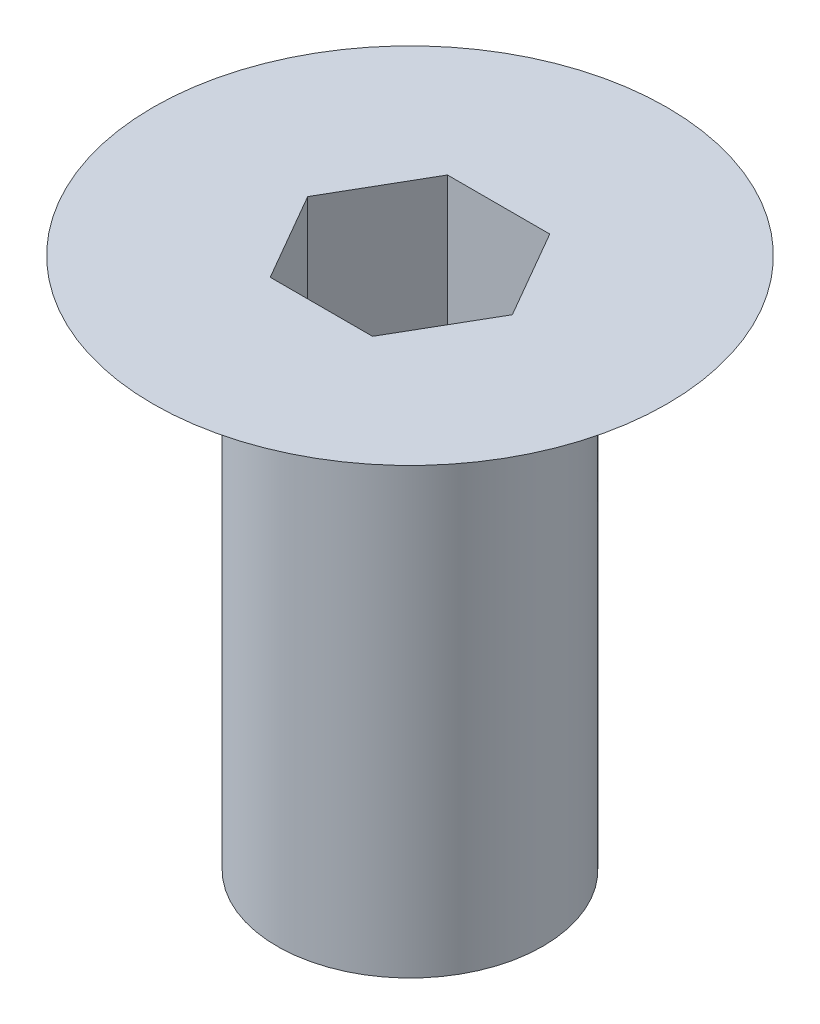
ISO-10303-21;
HEADER;
FILE_DESCRIPTION(('STEP AP214'),'2;1');
FILE_NAME('part.step','',(''),(''),'','','');
FILE_SCHEMA(('AUTOMOTIVE_DESIGN { 1 0 10303 214 1 1 1 1 }'));
ENDSEC;
DATA;
#1=APPLICATION_CONTEXT('core data for automotive mechanical design processes');
#2=APPLICATION_PROTOCOL_DEFINITION('international standard','automotive_design',2000,#1);
#3=PRODUCT_CONTEXT('',#1,'mechanical');
#4=PRODUCT('Part','Part','',(#3));
#5=PRODUCT_RELATED_PRODUCT_CATEGORY('part','',(#4));
#6=PRODUCT_DEFINITION_FORMATION('','',#4);
#7=PRODUCT_DEFINITION_CONTEXT('part definition',#1,'design');
#8=PRODUCT_DEFINITION('design','',#6,#7);
#9=PRODUCT_DEFINITION_SHAPE('','',#8);
#10=(LENGTH_UNIT() NAMED_UNIT(*) SI_UNIT(.MILLI.,.METRE.));
#11=(NAMED_UNIT(*) PLANE_ANGLE_UNIT() SI_UNIT($,.RADIAN.));
#12=(NAMED_UNIT(*) SI_UNIT($,.STERADIAN.) SOLID_ANGLE_UNIT());
#13=UNCERTAINTY_MEASURE_WITH_UNIT(LENGTH_MEASURE(1.E-05),#10,'distance_accuracy_value','');
#14=(GEOMETRIC_REPRESENTATION_CONTEXT(3) GLOBAL_UNCERTAINTY_ASSIGNED_CONTEXT((#13)) GLOBAL_UNIT_ASSIGNED_CONTEXT((#10,
#11,#12)) REPRESENTATION_CONTEXT('',''));
#15=CARTESIAN_POINT('',(0.,0.,0.));
#16=DIRECTION('',(0.,0.,1.));
#17=DIRECTION('',(1.,0.,0.));
#18=AXIS2_PLACEMENT_3D('',#15,#16,#17);
#19=CARTESIAN_POINT('',(0.,0.,0.));
#20=DIRECTION('',(0.,-1.,0.));
#21=DIRECTION('',(1.,0.,0.));
#22=AXIS2_PLACEMENT_3D('',#19,#20,#21);
#23=PLANE('',#22);
#24=DIRECTION('',(-1.,0.,0.));
#25=VECTOR('',#24,1.);
#26=CARTESIAN_POINT('',(0.577350269189626,0.,-1.));
#27=LINE('',#26,#25);
#28=CARTESIAN_POINT('',(0.577350269189626,0.,-1.));
#29=VERTEX_POINT('',#28);
#30=CARTESIAN_POINT('',(-0.577350269189626,0.,-1.));
#31=VERTEX_POINT('',#30);
#32=EDGE_CURVE('E134',#29,#31,#27,.T.);
#33=ORIENTED_EDGE('',*,*,#32,.F.);
#34=DIRECTION('',(-0.5,0.,-0.866025403784438));
#35=VECTOR('',#34,1.);
#36=CARTESIAN_POINT('',(1.15470053837925,0.,0.));
#37=LINE('',#36,#35);
#38=CARTESIAN_POINT('',(1.15470053837925,0.,0.));
#39=VERTEX_POINT('',#38);
#40=EDGE_CURVE('E54',#39,#29,#37,.T.);
#41=ORIENTED_EDGE('',*,*,#40,.F.);
#42=DIRECTION('',(0.5,0.,-0.866025403784439));
#43=VECTOR('',#42,1.);
#44=CARTESIAN_POINT('',(0.577350269189626,0.,1.));
#45=LINE('',#44,#43);
#46=CARTESIAN_POINT('',(0.577350269189626,0.,1.));
#47=VERTEX_POINT('',#46);
#48=EDGE_CURVE('E147',#47,#39,#45,.T.);
#49=ORIENTED_EDGE('',*,*,#48,.F.);
#50=DIRECTION('',(1.,0.,0.));
#51=VECTOR('',#50,1.);
#52=CARTESIAN_POINT('',(-0.577350269189625,0.,1.));
#53=LINE('',#52,#51);
#54=CARTESIAN_POINT('',(-0.577350269189625,0.,1.));
#55=VERTEX_POINT('',#54);
#56=EDGE_CURVE('E144',#55,#47,#53,.T.);
#57=ORIENTED_EDGE('',*,*,#56,.F.);
#58=DIRECTION('',(0.5,0.,0.866025403784438));
#59=VECTOR('',#58,1.);
#60=CARTESIAN_POINT('',(-1.15470053837925,0.,0.));
#61=LINE('',#60,#59);
#62=CARTESIAN_POINT('',(-1.15470053837925,0.,0.));
#63=VERTEX_POINT('',#62);
#64=EDGE_CURVE('E102',#63,#55,#61,.T.);
#65=ORIENTED_EDGE('',*,*,#64,.F.);
#66=DIRECTION('',(-0.5,0.,0.866025403784439));
#67=VECTOR('',#66,1.);
#68=CARTESIAN_POINT('',(-0.577350269189626,0.,-1.));
#69=LINE('',#68,#67);
#70=EDGE_CURVE('E138',#31,#63,#69,.T.);
#71=ORIENTED_EDGE('',*,*,#70,.F.);
#72=EDGE_LOOP('',(#33,#41,#49,#57,#65,#71));
#73=FACE_BOUND('',#72,.T.);
#74=CARTESIAN_POINT('',(0.,0.,0.));
#75=DIRECTION('',(0.,-1.,0.));
#76=DIRECTION('',(1.,0.,0.));
#77=AXIS2_PLACEMENT_3D('',#74,#75,#76);
#78=CIRCLE('',#77,2.9);
#79=CARTESIAN_POINT('',(2.9,0.,0.));
#80=VERTEX_POINT('',#79);
#81=EDGE_CURVE('E11',#80,#80,#78,.T.);
#82=ORIENTED_EDGE('',*,*,#81,.F.);
#83=EDGE_LOOP('',(#82));
#84=FACE_BOUND('',#83,.T.);
#85=ADVANCED_FACE('F39',(#73,#84),#23,.F.);
#86=CARTESIAN_POINT('',(0.,0.,0.));
#87=DIRECTION('',(0.,1.,0.));
#88=DIRECTION('',(-1.,0.,0.));
#89=AXIS2_PLACEMENT_3D('',#86,#87,#88);
#90=CONICAL_SURFACE('',#89,2.9,1.02974425867665);
#91=CARTESIAN_POINT('',(0.,-0.841204866638593,0.));
#92=DIRECTION('',(0.,-1.,0.));
#93=DIRECTION('',(1.,0.,0.));
#94=AXIS2_PLACEMENT_3D('',#91,#92,#93);
#95=CIRCLE('',#94,1.5);
#96=CARTESIAN_POINT('',(1.5,-0.841204866638593,0.));
#97=VERTEX_POINT('',#96);
#98=EDGE_CURVE('E47',#97,#97,#95,.T.);
#99=ORIENTED_EDGE('',*,*,#98,.F.);
#100=EDGE_LOOP('',(#99));
#101=FACE_BOUND('',#100,.T.);
#102=ORIENTED_EDGE('',*,*,#81,.T.);
#103=EDGE_LOOP('',(#102));
#104=FACE_BOUND('',#103,.T.);
#105=ADVANCED_FACE('F171',(#101,#104),#90,.T.);
#106=CARTESIAN_POINT('',(0.,-6.,0.));
#107=DIRECTION('',(0.,-1.,0.));
#108=DIRECTION('',(1.,0.,0.));
#109=AXIS2_PLACEMENT_3D('',#106,#107,#108);
#110=CYLINDRICAL_SURFACE('',#109,1.5);
#111=CARTESIAN_POINT('',(0.,-6.,0.));
#112=DIRECTION('',(0.,-1.,0.));
#113=DIRECTION('',(1.,0.,0.));
#114=AXIS2_PLACEMENT_3D('',#111,#112,#113);
#115=CIRCLE('',#114,1.5);
#116=CARTESIAN_POINT('',(1.5,-6.,0.));
#117=VERTEX_POINT('',#116);
#118=EDGE_CURVE('E153',#117,#117,#115,.T.);
#119=ORIENTED_EDGE('',*,*,#118,.F.);
#120=EDGE_LOOP('',(#119));
#121=FACE_BOUND('',#120,.T.);
#122=ORIENTED_EDGE('',*,*,#98,.T.);
#123=EDGE_LOOP('',(#122));
#124=FACE_BOUND('',#123,.T.);
#125=ADVANCED_FACE('F169',(#121,#124),#110,.T.);
#126=CARTESIAN_POINT('',(-1.5,-6.,0.));
#127=DIRECTION('',(0.,1.,0.));
#128=DIRECTION('',(-1.,0.,0.));
#129=AXIS2_PLACEMENT_3D('',#126,#127,#128);
#130=PLANE('',#129);
#131=ORIENTED_EDGE('',*,*,#118,.T.);
#132=EDGE_LOOP('',(#131));
#133=FACE_BOUND('',#132,.T.);
#134=ADVANCED_FACE('F191',(#133),#130,.F.);
#135=CARTESIAN_POINT('',(1.15470053837925,-1.5,0.));
#136=DIRECTION('',(0.866025403784439,0.,-0.5));
#137=DIRECTION('',(-0.5,0.,-0.866025403784439));
#138=AXIS2_PLACEMENT_3D('',#135,#136,#137);
#139=PLANE('',#138);
#140=ORIENTED_EDGE('',*,*,#40,.T.);
#141=DIRECTION('',(0.,1.,0.));
#142=VECTOR('',#141,1.);
#143=CARTESIAN_POINT('',(0.577350269189626,-1.5,-1.));
#144=LINE('',#143,#142);
#145=CARTESIAN_POINT('',(0.577350269189626,-1.5,-1.));
#146=VERTEX_POINT('',#145);
#147=EDGE_CURVE('E84',#146,#29,#144,.T.);
#148=ORIENTED_EDGE('',*,*,#147,.F.);
#149=DIRECTION('',(-0.5,0.,-0.866025403784438));
#150=VECTOR('',#149,1.);
#151=CARTESIAN_POINT('',(1.15470053837925,-1.5,0.));
#152=LINE('',#151,#150);
#153=CARTESIAN_POINT('',(1.15470053837925,-1.5,0.));
#154=VERTEX_POINT('',#153);
#155=EDGE_CURVE('E150',#154,#146,#152,.T.);
#156=ORIENTED_EDGE('',*,*,#155,.F.);
#157=DIRECTION('',(0.,1.,0.));
#158=VECTOR('',#157,1.);
#159=CARTESIAN_POINT('',(1.15470053837925,-1.5,0.));
#160=LINE('',#159,#158);
#161=EDGE_CURVE('E62',#154,#39,#160,.T.);
#162=ORIENTED_EDGE('',*,*,#161,.T.);
#163=EDGE_LOOP('',(#140,#148,#156,#162));
#164=FACE_BOUND('',#163,.T.);
#165=ADVANCED_FACE('F188',(#164),#139,.F.);
#166=CARTESIAN_POINT('',(0.577350269189626,-1.5,1.));
#167=DIRECTION('',(0.866025403784439,0.,0.5));
#168=DIRECTION('',(0.5,0.,-0.866025403784439));
#169=AXIS2_PLACEMENT_3D('',#166,#167,#168);
#170=PLANE('',#169);
#171=ORIENTED_EDGE('',*,*,#48,.T.);
#172=ORIENTED_EDGE('',*,*,#161,.F.);
#173=DIRECTION('',(0.5,0.,-0.866025403784439));
#174=VECTOR('',#173,1.);
#175=CARTESIAN_POINT('',(0.577350269189626,-1.5,1.));
#176=LINE('',#175,#174);
#177=CARTESIAN_POINT('',(0.577350269189626,-1.5,1.));
#178=VERTEX_POINT('',#177);
#179=EDGE_CURVE('E116',#178,#154,#176,.T.);
#180=ORIENTED_EDGE('',*,*,#179,.F.);
#181=DIRECTION('',(0.,1.,0.));
#182=VECTOR('',#181,1.);
#183=CARTESIAN_POINT('',(0.577350269189626,-1.5,1.));
#184=LINE('',#183,#182);
#185=EDGE_CURVE('E107',#178,#47,#184,.T.);
#186=ORIENTED_EDGE('',*,*,#185,.T.);
#187=EDGE_LOOP('',(#171,#172,#180,#186));
#188=FACE_BOUND('',#187,.T.);
#189=ADVANCED_FACE('F190',(#188),#170,.F.);
#190=CARTESIAN_POINT('',(-0.577350269189625,-1.5,1.));
#191=DIRECTION('',(0.,0.,1.));
#192=DIRECTION('',(1.,0.,0.));
#193=AXIS2_PLACEMENT_3D('',#190,#191,#192);
#194=PLANE('',#193);
#195=ORIENTED_EDGE('',*,*,#56,.T.);
#196=ORIENTED_EDGE('',*,*,#185,.F.);
#197=DIRECTION('',(1.,0.,0.));
#198=VECTOR('',#197,1.);
#199=CARTESIAN_POINT('',(-0.577350269189625,-1.5,1.));
#200=LINE('',#199,#198);
#201=CARTESIAN_POINT('',(-0.577350269189625,-1.5,1.));
#202=VERTEX_POINT('',#201);
#203=EDGE_CURVE('E111',#202,#178,#200,.T.);
#204=ORIENTED_EDGE('',*,*,#203,.F.);
#205=DIRECTION('',(0.,1.,0.));
#206=VECTOR('',#205,1.);
#207=CARTESIAN_POINT('',(-0.577350269189625,-1.5,1.));
#208=LINE('',#207,#206);
#209=EDGE_CURVE('E95',#202,#55,#208,.T.);
#210=ORIENTED_EDGE('',*,*,#209,.T.);
#211=EDGE_LOOP('',(#195,#196,#204,#210));
#212=FACE_BOUND('',#211,.T.);
#213=ADVANCED_FACE('F112',(#212),#194,.F.);
#214=CARTESIAN_POINT('',(-1.15470053837925,-1.5,0.));
#215=DIRECTION('',(-0.866025403784439,0.,0.5));
#216=DIRECTION('',(0.5,0.,0.866025403784439));
#217=AXIS2_PLACEMENT_3D('',#214,#215,#216);
#218=PLANE('',#217);
#219=ORIENTED_EDGE('',*,*,#64,.T.);
#220=ORIENTED_EDGE('',*,*,#209,.F.);
#221=DIRECTION('',(0.5,0.,0.866025403784438));
#222=VECTOR('',#221,1.);
#223=CARTESIAN_POINT('',(-1.15470053837925,-1.5,0.));
#224=LINE('',#223,#222);
#225=CARTESIAN_POINT('',(-1.15470053837925,-1.5,0.));
#226=VERTEX_POINT('',#225);
#227=EDGE_CURVE('E99',#226,#202,#224,.T.);
#228=ORIENTED_EDGE('',*,*,#227,.F.);
#229=DIRECTION('',(0.,1.,0.));
#230=VECTOR('',#229,1.);
#231=CARTESIAN_POINT('',(-1.15470053837925,-1.5,0.));
#232=LINE('',#231,#230);
#233=EDGE_CURVE('E108',#226,#63,#232,.T.);
#234=ORIENTED_EDGE('',*,*,#233,.T.);
#235=EDGE_LOOP('',(#219,#220,#228,#234));
#236=FACE_BOUND('',#235,.T.);
#237=ADVANCED_FACE('F97',(#236),#218,.F.);
#238=CARTESIAN_POINT('',(-0.577350269189626,-1.5,-1.));
#239=DIRECTION('',(-0.866025403784439,0.,-0.5));
#240=DIRECTION('',(-0.5,0.,0.866025403784439));
#241=AXIS2_PLACEMENT_3D('',#238,#239,#240);
#242=PLANE('',#241);
#243=ORIENTED_EDGE('',*,*,#70,.T.);
#244=ORIENTED_EDGE('',*,*,#233,.F.);
#245=DIRECTION('',(-0.5,0.,0.866025403784439));
#246=VECTOR('',#245,1.);
#247=CARTESIAN_POINT('',(-0.577350269189626,-1.5,-1.));
#248=LINE('',#247,#246);
#249=CARTESIAN_POINT('',(-0.577350269189626,-1.5,-1.));
#250=VERTEX_POINT('',#249);
#251=EDGE_CURVE('E122',#250,#226,#248,.T.);
#252=ORIENTED_EDGE('',*,*,#251,.F.);
#253=DIRECTION('',(0.,1.,0.));
#254=VECTOR('',#253,1.);
#255=CARTESIAN_POINT('',(-0.577350269189626,-1.5,-1.));
#256=LINE('',#255,#254);
#257=EDGE_CURVE('E158',#250,#31,#256,.T.);
#258=ORIENTED_EDGE('',*,*,#257,.T.);
#259=EDGE_LOOP('',(#243,#244,#252,#258));
#260=FACE_BOUND('',#259,.T.);
#261=ADVANCED_FACE('F246',(#260),#242,.F.);
#262=CARTESIAN_POINT('',(0.577350269189626,-1.5,-1.));
#263=DIRECTION('',(0.,0.,-1.));
#264=DIRECTION('',(-1.,0.,0.));
#265=AXIS2_PLACEMENT_3D('',#262,#263,#264);
#266=PLANE('',#265);
#267=ORIENTED_EDGE('',*,*,#32,.T.);
#268=ORIENTED_EDGE('',*,*,#257,.F.);
#269=DIRECTION('',(-1.,0.,0.));
#270=VECTOR('',#269,1.);
#271=CARTESIAN_POINT('',(0.577350269189626,-1.5,-1.));
#272=LINE('',#271,#270);
#273=EDGE_CURVE('E126',#146,#250,#272,.T.);
#274=ORIENTED_EDGE('',*,*,#273,.F.);
#275=ORIENTED_EDGE('',*,*,#147,.T.);
#276=EDGE_LOOP('',(#267,#268,#274,#275));
#277=FACE_BOUND('',#276,.T.);
#278=ADVANCED_FACE('F184',(#277),#266,.F.);
#279=CARTESIAN_POINT('',(0.,-1.5,0.));
#280=DIRECTION('',(0.,1.,0.));
#281=DIRECTION('',(0.,0.,1.));
#282=AXIS2_PLACEMENT_3D('',#279,#280,#281);
#283=PLANE('',#282);
#284=ORIENTED_EDGE('',*,*,#155,.T.);
#285=ORIENTED_EDGE('',*,*,#273,.T.);
#286=ORIENTED_EDGE('',*,*,#251,.T.);
#287=ORIENTED_EDGE('',*,*,#227,.T.);
#288=ORIENTED_EDGE('',*,*,#203,.T.);
#289=ORIENTED_EDGE('',*,*,#179,.T.);
#290=EDGE_LOOP('',(#284,#285,#286,#287,#288,#289));
#291=FACE_BOUND('',#290,.T.);
#292=ADVANCED_FACE('F119',(#291),#283,.T.);
#293=CLOSED_SHELL('',(#85,#105,#125,#134,#165,#189,#213,#237,#261,#278,#292));
#294=MANIFOLD_SOLID_BREP('B2',#293);
#295=ADVANCED_BREP_SHAPE_REPRESENTATION('',(#18,#294),#14);
#296=SHAPE_DEFINITION_REPRESENTATION(#9,#295);
ENDSEC;
END-ISO-10303-21;
